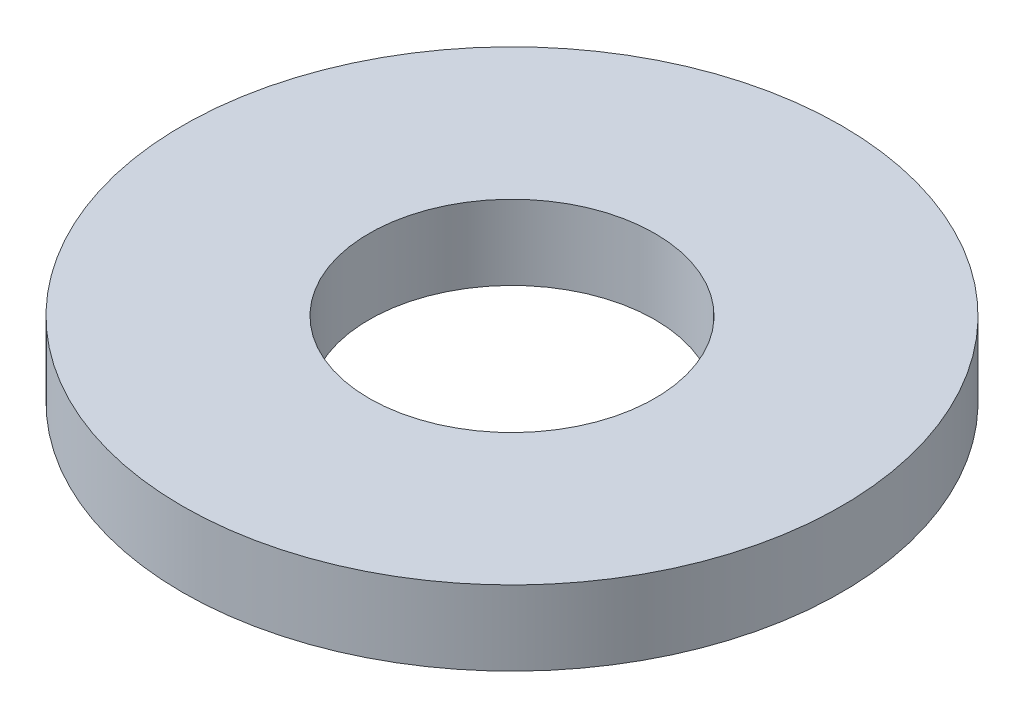
ISO-10303-21;
HEADER;
FILE_DESCRIPTION(('STEP AP214'),'2;1');
FILE_NAME('part.step','',(''),(''),'','','');
FILE_SCHEMA(('AUTOMOTIVE_DESIGN { 1 0 10303 214 1 1 1 1 }'));
ENDSEC;
DATA;
#1=APPLICATION_CONTEXT('core data for automotive mechanical design processes');
#2=APPLICATION_PROTOCOL_DEFINITION('international standard','automotive_design',2000,#1);
#3=PRODUCT_CONTEXT('',#1,'mechanical');
#4=PRODUCT('Part','Part','',(#3));
#5=PRODUCT_RELATED_PRODUCT_CATEGORY('part','',(#4));
#6=PRODUCT_DEFINITION_FORMATION('','',#4);
#7=PRODUCT_DEFINITION_CONTEXT('part definition',#1,'design');
#8=PRODUCT_DEFINITION('design','',#6,#7);
#9=PRODUCT_DEFINITION_SHAPE('','',#8);
#10=(LENGTH_UNIT() NAMED_UNIT(*) SI_UNIT(.MILLI.,.METRE.));
#11=(NAMED_UNIT(*) PLANE_ANGLE_UNIT() SI_UNIT($,.RADIAN.));
#12=(NAMED_UNIT(*) SI_UNIT($,.STERADIAN.) SOLID_ANGLE_UNIT());
#13=UNCERTAINTY_MEASURE_WITH_UNIT(LENGTH_MEASURE(1.E-05),#10,'distance_accuracy_value','');
#14=(GEOMETRIC_REPRESENTATION_CONTEXT(3) GLOBAL_UNCERTAINTY_ASSIGNED_CONTEXT((#13)) GLOBAL_UNIT_ASSIGNED_CONTEXT((#10,
#11,#12)) REPRESENTATION_CONTEXT('',''));
#15=CARTESIAN_POINT('',(0.,0.,0.));
#16=DIRECTION('',(0.,0.,1.));
#17=DIRECTION('',(1.,0.,0.));
#18=AXIS2_PLACEMENT_3D('',#15,#16,#17);
#19=CARTESIAN_POINT('',(0.,15.524,0.));
#20=DIRECTION('',(0.,1.,0.));
#21=DIRECTION('',(0.,0.,1.));
#22=AXIS2_PLACEMENT_3D('',#19,#20,#21);
#23=PLANE('',#22);
#24=CARTESIAN_POINT('',(0.,15.524,0.));
#25=DIRECTION('',(0.,1.,0.));
#26=DIRECTION('',(0.,0.,1.));
#27=AXIS2_PLACEMENT_3D('',#24,#25,#26);
#28=CIRCLE('',#27,68.52);
#29=CARTESIAN_POINT('',(0.,15.524,-68.52));
#30=VERTEX_POINT('',#29);
#31=EDGE_CURVE('E10',#30,#30,#28,.T.);
#32=ORIENTED_EDGE('',*,*,#31,.T.);
#33=EDGE_LOOP('',(#32));
#34=FACE_BOUND('',#33,.T.);
#35=CARTESIAN_POINT('',(0.,15.524,0.));
#36=DIRECTION('',(0.,1.,0.));
#37=DIRECTION('',(0.,0.,1.));
#38=AXIS2_PLACEMENT_3D('',#35,#36,#37);
#39=CIRCLE('',#38,29.71);
#40=CARTESIAN_POINT('',(0.,15.524,-29.71));
#41=VERTEX_POINT('',#40);
#42=EDGE_CURVE('E40',#41,#41,#39,.T.);
#43=ORIENTED_EDGE('',*,*,#42,.F.);
#44=EDGE_LOOP('',(#43));
#45=FACE_BOUND('',#44,.T.);
#46=ADVANCED_FACE('F29',(#34,#45),#23,.T.);
#47=CARTESIAN_POINT('',(0.,0.,0.));
#48=DIRECTION('',(0.,1.,0.));
#49=DIRECTION('',(0.,0.,1.));
#50=AXIS2_PLACEMENT_3D('',#47,#48,#49);
#51=PLANE('',#50);
#52=CARTESIAN_POINT('',(0.,0.,0.));
#53=DIRECTION('',(0.,1.,0.));
#54=DIRECTION('',(0.,0.,1.));
#55=AXIS2_PLACEMENT_3D('',#52,#53,#54);
#56=CIRCLE('',#55,68.52);
#57=CARTESIAN_POINT('',(0.,0.,-68.52));
#58=VERTEX_POINT('',#57);
#59=EDGE_CURVE('E33',#58,#58,#56,.T.);
#60=ORIENTED_EDGE('',*,*,#59,.F.);
#61=EDGE_LOOP('',(#60));
#62=FACE_BOUND('',#61,.T.);
#63=CARTESIAN_POINT('',(0.,0.,0.));
#64=DIRECTION('',(0.,1.,0.));
#65=DIRECTION('',(0.,0.,1.));
#66=AXIS2_PLACEMENT_3D('',#63,#64,#65);
#67=CIRCLE('',#66,29.71);
#68=CARTESIAN_POINT('',(0.,0.,-29.71));
#69=VERTEX_POINT('',#68);
#70=EDGE_CURVE('E42',#69,#69,#67,.T.);
#71=ORIENTED_EDGE('',*,*,#70,.T.);
#72=EDGE_LOOP('',(#71));
#73=FACE_BOUND('',#72,.T.);
#74=ADVANCED_FACE('F52',(#62,#73),#51,.F.);
#75=CARTESIAN_POINT('',(0.,15.524,0.));
#76=DIRECTION('',(0.,-1.,0.));
#77=DIRECTION('',(0.,0.,-1.));
#78=AXIS2_PLACEMENT_3D('',#75,#76,#77);
#79=CYLINDRICAL_SURFACE('',#78,68.52);
#80=CARTESIAN_POINT('',(0.,15.524,-68.52));
#81=CARTESIAN_POINT('',(0.,15.3622916666667,-68.52));
#82=CARTESIAN_POINT('',(0.,15.2005833333333,-68.52));
#83=CARTESIAN_POINT('',(0.,14.8771666666667,-68.52));
#84=CARTESIAN_POINT('',(0.,14.7154583333333,-68.52));
#85=CARTESIAN_POINT('',(0.,14.3920416666667,-68.52));
#86=CARTESIAN_POINT('',(0.,14.2303333333333,-68.52));
#87=CARTESIAN_POINT('',(0.,13.9069166666667,-68.52));
#88=CARTESIAN_POINT('',(0.,13.7452083333333,-68.52));
#89=CARTESIAN_POINT('',(0.,13.4217916666667,-68.52));
#90=CARTESIAN_POINT('',(0.,13.2600833333333,-68.52));
#91=CARTESIAN_POINT('',(0.,12.9366666666667,-68.52));
#92=CARTESIAN_POINT('',(0.,12.7749583333333,-68.52));
#93=CARTESIAN_POINT('',(0.,12.4515416666667,-68.52));
#94=CARTESIAN_POINT('',(0.,12.2898333333333,-68.52));
#95=CARTESIAN_POINT('',(0.,11.9664166666667,-68.52));
#96=CARTESIAN_POINT('',(0.,11.8047083333333,-68.52));
#97=CARTESIAN_POINT('',(0.,11.4812916666667,-68.52));
#98=CARTESIAN_POINT('',(0.,11.3195833333333,-68.52));
#99=CARTESIAN_POINT('',(0.,10.9961666666667,-68.52));
#100=CARTESIAN_POINT('',(0.,10.8344583333333,-68.52));
#101=CARTESIAN_POINT('',(0.,10.5110416666667,-68.52));
#102=CARTESIAN_POINT('',(0.,10.3493333333333,-68.52));
#103=CARTESIAN_POINT('',(0.,10.0259166666667,-68.52));
#104=CARTESIAN_POINT('',(0.,9.86420833333333,-68.52));
#105=CARTESIAN_POINT('',(0.,9.54079166666666,-68.52));
#106=CARTESIAN_POINT('',(0.,9.37908333333333,-68.52));
#107=CARTESIAN_POINT('',(0.,9.05566666666666,-68.52));
#108=CARTESIAN_POINT('',(0.,8.89395833333333,-68.52));
#109=CARTESIAN_POINT('',(0.,8.57054166666666,-68.52));
#110=CARTESIAN_POINT('',(0.,8.40883333333333,-68.52));
#111=CARTESIAN_POINT('',(0.,8.08541666666666,-68.52));
#112=CARTESIAN_POINT('',(0.,7.92370833333333,-68.52));
#113=CARTESIAN_POINT('',(0.,7.60029166666666,-68.52));
#114=CARTESIAN_POINT('',(0.,7.43858333333333,-68.52));
#115=CARTESIAN_POINT('',(0.,7.11516666666666,-68.52));
#116=CARTESIAN_POINT('',(0.,6.95345833333333,-68.52));
#117=CARTESIAN_POINT('',(0.,6.63004166666666,-68.52));
#118=CARTESIAN_POINT('',(0.,6.46833333333333,-68.52));
#119=CARTESIAN_POINT('',(0.,6.14491666666667,-68.52));
#120=CARTESIAN_POINT('',(0.,5.98320833333333,-68.52));
#121=CARTESIAN_POINT('',(0.,5.65979166666666,-68.52));
#122=CARTESIAN_POINT('',(0.,5.49808333333333,-68.52));
#123=CARTESIAN_POINT('',(0.,5.17466666666666,-68.52));
#124=CARTESIAN_POINT('',(0.,5.01295833333333,-68.52));
#125=CARTESIAN_POINT('',(0.,4.68954166666667,-68.52));
#126=CARTESIAN_POINT('',(0.,4.52783333333333,-68.52));
#127=CARTESIAN_POINT('',(0.,4.20441666666666,-68.52));
#128=CARTESIAN_POINT('',(0.,4.04270833333333,-68.52));
#129=CARTESIAN_POINT('',(0.,3.71929166666666,-68.52));
#130=CARTESIAN_POINT('',(0.,3.55758333333333,-68.52));
#131=CARTESIAN_POINT('',(0.,3.23416666666666,-68.52));
#132=CARTESIAN_POINT('',(0.,3.07245833333333,-68.52));
#133=CARTESIAN_POINT('',(0.,2.74904166666667,-68.52));
#134=CARTESIAN_POINT('',(0.,2.58733333333333,-68.52));
#135=CARTESIAN_POINT('',(0.,2.26391666666667,-68.52));
#136=CARTESIAN_POINT('',(0.,2.10220833333333,-68.52));
#137=CARTESIAN_POINT('',(0.,1.77879166666666,-68.52));
#138=CARTESIAN_POINT('',(0.,1.61708333333333,-68.52));
#139=CARTESIAN_POINT('',(0.,1.29366666666667,-68.52));
#140=CARTESIAN_POINT('',(0.,1.13195833333333,-68.52));
#141=CARTESIAN_POINT('',(0.,0.808541666666665,-68.52));
#142=CARTESIAN_POINT('',(0.,0.646833333333331,-68.52));
#143=CARTESIAN_POINT('',(0.,0.323416666666664,-68.52));
#144=CARTESIAN_POINT('',(0.,0.161708333333331,-68.52));
#145=CARTESIAN_POINT('',(0.,0.,-68.52));
#146=B_SPLINE_CURVE_WITH_KNOTS('',3,(#80,#81,#82,#83,#84,#85,#86,#87,#88,#89,#90,#91,#92,#93,
#94,#95,#96,#97,#98,#99,#100,#101,#102,#103,#104,#105,#106,#107,#108,#109,#110,#111,#112,#113,
#114,#115,#116,#117,#118,#119,#120,#121,#122,#123,#124,#125,#126,#127,#128,#129,#130,#131,#132,
#133,#134,#135,#136,#137,#138,#139,#140,#141,#142,#143,#144,#145),.UNSPECIFIED.,.F.,.F.,(4,2,2,
2,2,2,2,2,2,2,2,2,2,2,2,2,2,2,2,2,2,2,2,2,2,2,2,2,2,2,2,2,4),(0.,0.485125000000001,
0.970250000000001,1.455375,1.9405,2.425625,2.91075,3.395875,3.881,4.366125,4.85125,5.336375,
5.8215,6.306625,6.79175,7.276875,7.762,8.247125,8.73225,9.217375,9.7025,10.187625,10.67275,
11.157875,11.643,12.128125,12.61325,13.098375,13.5835,14.068625,14.55375,15.038875,15.524),.UNSPECIFIED.);
#147=EDGE_CURVE('BSEAM31',#30,#58,#146,.T.);
#148=ORIENTED_EDGE('',*,*,#31,.F.);
#149=ORIENTED_EDGE('',*,*,#59,.T.);
#150=ORIENTED_EDGE('',*,*,#147,.T.);
#151=ORIENTED_EDGE('',*,*,#147,.F.);
#152=EDGE_LOOP('',(#148,#150,#149,#151));
#153=FACE_BOUND('',#152,.T.);
#154=ADVANCED_FACE('F31',(#153),#79,.T.);
#155=CARTESIAN_POINT('',(0.,15.524,0.));
#156=DIRECTION('',(0.,-1.,0.));
#157=DIRECTION('',(0.,0.,-1.));
#158=AXIS2_PLACEMENT_3D('',#155,#156,#157);
#159=CYLINDRICAL_SURFACE('',#158,29.71);
#160=CARTESIAN_POINT('',(0.,15.524,-29.71));
#161=CARTESIAN_POINT('',(0.,15.3622916666667,-29.71));
#162=CARTESIAN_POINT('',(0.,15.2005833333333,-29.71));
#163=CARTESIAN_POINT('',(0.,14.8771666666667,-29.71));
#164=CARTESIAN_POINT('',(0.,14.7154583333333,-29.71));
#165=CARTESIAN_POINT('',(0.,14.3920416666667,-29.71));
#166=CARTESIAN_POINT('',(0.,14.2303333333333,-29.71));
#167=CARTESIAN_POINT('',(0.,13.9069166666667,-29.71));
#168=CARTESIAN_POINT('',(0.,13.7452083333333,-29.71));
#169=CARTESIAN_POINT('',(0.,13.4217916666667,-29.71));
#170=CARTESIAN_POINT('',(0.,13.2600833333333,-29.71));
#171=CARTESIAN_POINT('',(0.,12.9366666666667,-29.71));
#172=CARTESIAN_POINT('',(0.,12.7749583333333,-29.71));
#173=CARTESIAN_POINT('',(0.,12.4515416666667,-29.71));
#174=CARTESIAN_POINT('',(0.,12.2898333333333,-29.71));
#175=CARTESIAN_POINT('',(0.,11.9664166666667,-29.71));
#176=CARTESIAN_POINT('',(0.,11.8047083333333,-29.71));
#177=CARTESIAN_POINT('',(0.,11.4812916666667,-29.71));
#178=CARTESIAN_POINT('',(0.,11.3195833333333,-29.71));
#179=CARTESIAN_POINT('',(0.,10.9961666666667,-29.71));
#180=CARTESIAN_POINT('',(0.,10.8344583333333,-29.71));
#181=CARTESIAN_POINT('',(0.,10.5110416666667,-29.71));
#182=CARTESIAN_POINT('',(0.,10.3493333333333,-29.71));
#183=CARTESIAN_POINT('',(0.,10.0259166666667,-29.71));
#184=CARTESIAN_POINT('',(0.,9.86420833333333,-29.71));
#185=CARTESIAN_POINT('',(0.,9.54079166666666,-29.71));
#186=CARTESIAN_POINT('',(0.,9.37908333333333,-29.71));
#187=CARTESIAN_POINT('',(0.,9.05566666666666,-29.71));
#188=CARTESIAN_POINT('',(0.,8.89395833333333,-29.71));
#189=CARTESIAN_POINT('',(0.,8.57054166666666,-29.71));
#190=CARTESIAN_POINT('',(0.,8.40883333333333,-29.71));
#191=CARTESIAN_POINT('',(0.,8.08541666666666,-29.71));
#192=CARTESIAN_POINT('',(0.,7.92370833333333,-29.71));
#193=CARTESIAN_POINT('',(0.,7.60029166666666,-29.71));
#194=CARTESIAN_POINT('',(0.,7.43858333333333,-29.71));
#195=CARTESIAN_POINT('',(0.,7.11516666666666,-29.71));
#196=CARTESIAN_POINT('',(0.,6.95345833333333,-29.71));
#197=CARTESIAN_POINT('',(0.,6.63004166666666,-29.71));
#198=CARTESIAN_POINT('',(0.,6.46833333333333,-29.71));
#199=CARTESIAN_POINT('',(0.,6.14491666666666,-29.71));
#200=CARTESIAN_POINT('',(0.,5.98320833333333,-29.71));
#201=CARTESIAN_POINT('',(0.,5.65979166666666,-29.71));
#202=CARTESIAN_POINT('',(0.,5.49808333333333,-29.71));
#203=CARTESIAN_POINT('',(0.,5.17466666666666,-29.71));
#204=CARTESIAN_POINT('',(0.,5.01295833333333,-29.71));
#205=CARTESIAN_POINT('',(0.,4.68954166666667,-29.71));
#206=CARTESIAN_POINT('',(0.,4.52783333333333,-29.71));
#207=CARTESIAN_POINT('',(0.,4.20441666666666,-29.71));
#208=CARTESIAN_POINT('',(0.,4.04270833333333,-29.71));
#209=CARTESIAN_POINT('',(0.,3.71929166666666,-29.71));
#210=CARTESIAN_POINT('',(0.,3.55758333333333,-29.71));
#211=CARTESIAN_POINT('',(0.,3.23416666666666,-29.71));
#212=CARTESIAN_POINT('',(0.,3.07245833333333,-29.71));
#213=CARTESIAN_POINT('',(0.,2.74904166666666,-29.71));
#214=CARTESIAN_POINT('',(0.,2.58733333333333,-29.71));
#215=CARTESIAN_POINT('',(0.,2.26391666666666,-29.71));
#216=CARTESIAN_POINT('',(0.,2.10220833333333,-29.71));
#217=CARTESIAN_POINT('',(0.,1.77879166666666,-29.71));
#218=CARTESIAN_POINT('',(0.,1.61708333333333,-29.71));
#219=CARTESIAN_POINT('',(0.,1.29366666666667,-29.71));
#220=CARTESIAN_POINT('',(0.,1.13195833333333,-29.71));
#221=CARTESIAN_POINT('',(0.,0.808541666666665,-29.71));
#222=CARTESIAN_POINT('',(0.,0.646833333333331,-29.71));
#223=CARTESIAN_POINT('',(0.,0.323416666666664,-29.71));
#224=CARTESIAN_POINT('',(0.,0.161708333333331,-29.71));
#225=CARTESIAN_POINT('',(0.,0.,-29.71));
#226=B_SPLINE_CURVE_WITH_KNOTS('',3,(#160,#161,#162,#163,#164,#165,#166,#167,#168,#169,#170,
#171,#172,#173,#174,#175,#176,#177,#178,#179,#180,#181,#182,#183,#184,#185,#186,#187,#188,#189,
#190,#191,#192,#193,#194,#195,#196,#197,#198,#199,#200,#201,#202,#203,#204,#205,#206,#207,#208,
#209,#210,#211,#212,#213,#214,#215,#216,#217,#218,#219,#220,#221,#222,#223,#224,#225),
.UNSPECIFIED.,.F.,.F.,(4,2,2,2,2,2,2,2,2,2,2,2,2,2,2,2,2,2,2,2,2,2,2,2,2,2,2,2,2,2,2,2,4),(0.,
0.485124999999999,0.970249999999999,1.455375,1.9405,2.425625,2.91075,3.395875,3.881,4.366125,
4.85125,5.336375,5.8215,6.306625,6.79175,7.276875,7.762,8.247125,8.73225,9.217375,9.7025,
10.187625,10.67275,11.157875,11.643,12.128125,12.61325,13.098375,13.5835,14.068625,14.55375,
15.038875,15.524),.UNSPECIFIED.);
#227=EDGE_CURVE('BSEAM48',#41,#69,#226,.T.);
#228=ORIENTED_EDGE('',*,*,#42,.T.);
#229=ORIENTED_EDGE('',*,*,#70,.F.);
#230=ORIENTED_EDGE('',*,*,#227,.T.);
#231=ORIENTED_EDGE('',*,*,#227,.F.);
#232=EDGE_LOOP('',(#228,#230,#229,#231));
#233=FACE_BOUND('',#232,.T.);
#234=ADVANCED_FACE('F48',(#233),#159,.F.);
#235=CLOSED_SHELL('',(#46,#74,#154,#234));
#236=MANIFOLD_SOLID_BREP('B2',#235);
#237=ADVANCED_BREP_SHAPE_REPRESENTATION('',(#18,#236),#14);
#238=SHAPE_DEFINITION_REPRESENTATION(#9,#237);
ENDSEC;
END-ISO-10303-21;
